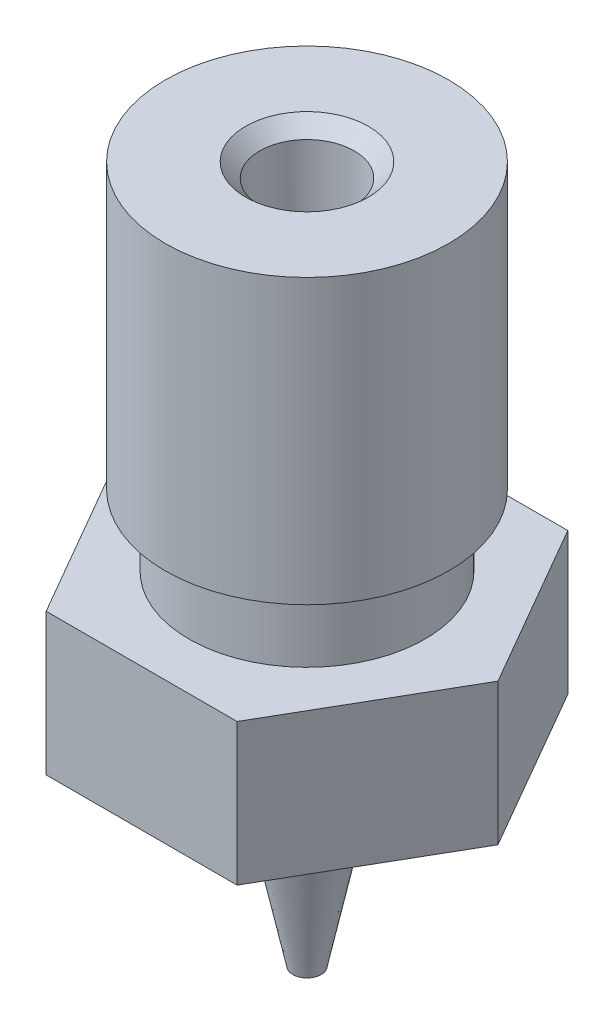
ISO-10303-21;
HEADER;
FILE_DESCRIPTION(('STEP AP214'),'2;1');
FILE_NAME('part.step','',(''),(''),'','','');
FILE_SCHEMA(('AUTOMOTIVE_DESIGN { 1 0 10303 214 1 1 1 1 }'));
ENDSEC;
DATA;
#1=APPLICATION_CONTEXT('core data for automotive mechanical design processes');
#2=APPLICATION_PROTOCOL_DEFINITION('international standard','automotive_design',2000,#1);
#3=PRODUCT_CONTEXT('',#1,'mechanical');
#4=PRODUCT('Part','Part','',(#3));
#5=PRODUCT_RELATED_PRODUCT_CATEGORY('part','',(#4));
#6=PRODUCT_DEFINITION_FORMATION('','',#4);
#7=PRODUCT_DEFINITION_CONTEXT('part definition',#1,'design');
#8=PRODUCT_DEFINITION('design','',#6,#7);
#9=PRODUCT_DEFINITION_SHAPE('','',#8);
#10=(LENGTH_UNIT() NAMED_UNIT(*) SI_UNIT(.MILLI.,.METRE.));
#11=(NAMED_UNIT(*) PLANE_ANGLE_UNIT() SI_UNIT($,.RADIAN.));
#12=(NAMED_UNIT(*) SI_UNIT($,.STERADIAN.) SOLID_ANGLE_UNIT());
#13=UNCERTAINTY_MEASURE_WITH_UNIT(LENGTH_MEASURE(1.E-05),#10,'distance_accuracy_value','');
#14=(GEOMETRIC_REPRESENTATION_CONTEXT(3) GLOBAL_UNCERTAINTY_ASSIGNED_CONTEXT((#13)) GLOBAL_UNIT_ASSIGNED_CONTEXT((#10,
#11,#12)) REPRESENTATION_CONTEXT('',''));
#15=CARTESIAN_POINT('',(0.,0.,0.));
#16=DIRECTION('',(0.,0.,1.));
#17=DIRECTION('',(1.,0.,0.));
#18=AXIS2_PLACEMENT_3D('',#15,#16,#17);
#19=CARTESIAN_POINT('',(0.,0.,0.));
#20=DIRECTION('',(0.,1.,0.));
#21=DIRECTION('',(-1.,0.,0.));
#22=AXIS2_PLACEMENT_3D('',#19,#20,#21);
#23=CONICAL_SURFACE('',#22,0.500000000000001,0.610865238198013);
#24=CARTESIAN_POINT('',(0.,2.,0.));
#25=DIRECTION('',(0.,1.,0.));
#26=DIRECTION('',(-1.,0.,0.));
#27=AXIS2_PLACEMENT_3D('',#24,#25,#26);
#28=CIRCLE('',#27,1.90041507641941);
#29=CARTESIAN_POINT('',(-1.90041507641941,2.,0.));
#30=VERTEX_POINT('',#29);
#31=EDGE_CURVE('E86',#30,#30,#28,.T.);
#32=ORIENTED_EDGE('',*,*,#31,.F.);
#33=EDGE_LOOP('',(#32));
#34=FACE_BOUND('',#33,.T.);
#35=CARTESIAN_POINT('',(0.,1.1425184053937,0.));
#36=DIRECTION('',(0.,1.,0.));
#37=DIRECTION('',(-1.,0.,0.));
#38=AXIS2_PLACEMENT_3D('',#35,#36,#37);
#39=CIRCLE('',#38,1.3);
#40=CARTESIAN_POINT('',(-1.3,1.1425184053937,0.));
#41=VERTEX_POINT('',#40);
#42=EDGE_CURVE('E12',#41,#41,#39,.F.);
#43=ORIENTED_EDGE('',*,*,#42,.F.);
#44=EDGE_LOOP('',(#43));
#45=FACE_BOUND('',#44,.T.);
#46=ADVANCED_FACE('F77',(#34,#45),#23,.T.);
#47=CARTESIAN_POINT('',(1.90041507641941,2.,0.));
#48=DIRECTION('',(0.,1.,0.));
#49=DIRECTION('',(-1.,0.,0.));
#50=AXIS2_PLACEMENT_3D('',#47,#48,#49);
#51=PLANE('',#50);
#52=DIRECTION('',(0.499999999999999,0.,0.866025403784439));
#53=VECTOR('',#52,1.);
#54=CARTESIAN_POINT('',(3.03108891324554,2.,-1.75));
#55=LINE('',#54,#53);
#56=CARTESIAN_POINT('',(2.02072594216369,2.,-3.5));
#57=VERTEX_POINT('',#56);
#58=CARTESIAN_POINT('',(4.04145188432738,2.,0.));
#59=VERTEX_POINT('',#58);
#60=EDGE_CURVE('E165',#57,#59,#55,.T.);
#61=ORIENTED_EDGE('',*,*,#60,.T.);
#62=DIRECTION('',(-0.5,0.,0.866025403784439));
#63=VECTOR('',#62,1.);
#64=CARTESIAN_POINT('',(3.03108891324553,2.,1.75));
#65=LINE('',#64,#63);
#66=CARTESIAN_POINT('',(2.02072594216369,2.,3.5));
#67=VERTEX_POINT('',#66);
#68=EDGE_CURVE('E151',#59,#67,#65,.T.);
#69=ORIENTED_EDGE('',*,*,#68,.T.);
#70=DIRECTION('',(-1.,0.,0.));
#71=VECTOR('',#70,1.);
#72=CARTESIAN_POINT('',(0.,2.,3.5));
#73=LINE('',#72,#71);
#74=CARTESIAN_POINT('',(-2.02072594216369,2.,3.5));
#75=VERTEX_POINT('',#74);
#76=EDGE_CURVE('E177',#67,#75,#73,.T.);
#77=ORIENTED_EDGE('',*,*,#76,.T.);
#78=DIRECTION('',(-0.5,0.,-0.866025403784439));
#79=VECTOR('',#78,1.);
#80=CARTESIAN_POINT('',(-3.03108891324554,2.,1.75));
#81=LINE('',#80,#79);
#82=CARTESIAN_POINT('',(-4.04145188432738,2.,0.));
#83=VERTEX_POINT('',#82);
#84=EDGE_CURVE('E181',#75,#83,#81,.T.);
#85=ORIENTED_EDGE('',*,*,#84,.T.);
#86=DIRECTION('',(0.5,0.,-0.866025403784438));
#87=VECTOR('',#86,1.);
#88=CARTESIAN_POINT('',(-3.03108891324553,2.,-1.75));
#89=LINE('',#88,#87);
#90=CARTESIAN_POINT('',(-2.02072594216369,2.,-3.5));
#91=VERTEX_POINT('',#90);
#92=EDGE_CURVE('E187',#83,#91,#89,.T.);
#93=ORIENTED_EDGE('',*,*,#92,.T.);
#94=DIRECTION('',(1.,0.,0.));
#95=VECTOR('',#94,1.);
#96=CARTESIAN_POINT('',(0.,2.,-3.5));
#97=LINE('',#96,#95);
#98=EDGE_CURVE('E158',#91,#57,#97,.T.);
#99=ORIENTED_EDGE('',*,*,#98,.T.);
#100=EDGE_LOOP('',(#61,#69,#77,#85,#93,#99));
#101=FACE_BOUND('',#100,.T.);
#102=ORIENTED_EDGE('',*,*,#31,.T.);
#103=EDGE_LOOP('',(#102));
#104=FACE_BOUND('',#103,.T.);
#105=ADVANCED_FACE('F222',(#101,#104),#51,.F.);
#106=CARTESIAN_POINT('',(3.5,5.,0.));
#107=DIRECTION('',(0.,-1.,0.));
#108=DIRECTION('',(1.,0.,0.));
#109=AXIS2_PLACEMENT_3D('',#106,#107,#108);
#110=PLANE('',#109);
#111=CARTESIAN_POINT('',(0.,5.,0.));
#112=DIRECTION('',(0.,1.,0.));
#113=DIRECTION('',(-1.,0.,0.));
#114=AXIS2_PLACEMENT_3D('',#111,#112,#113);
#115=CIRCLE('',#114,2.5);
#116=CARTESIAN_POINT('',(-2.5,5.,0.));
#117=VERTEX_POINT('',#116);
#118=EDGE_CURVE('E216',#117,#117,#115,.T.);
#119=ORIENTED_EDGE('',*,*,#118,.F.);
#120=EDGE_LOOP('',(#119));
#121=FACE_BOUND('',#120,.T.);
#122=DIRECTION('',(-0.5,0.,-0.866025403784439));
#123=VECTOR('',#122,1.);
#124=CARTESIAN_POINT('',(-3.03108891324554,5.,1.75));
#125=LINE('',#124,#123);
#126=CARTESIAN_POINT('',(-2.02072594216369,5.,3.5));
#127=VERTEX_POINT('',#126);
#128=CARTESIAN_POINT('',(-4.04145188432738,5.,0.));
#129=VERTEX_POINT('',#128);
#130=EDGE_CURVE('E183',#127,#129,#125,.T.);
#131=ORIENTED_EDGE('',*,*,#130,.F.);
#132=DIRECTION('',(-1.,0.,0.));
#133=VECTOR('',#132,1.);
#134=CARTESIAN_POINT('',(0.,5.,3.5));
#135=LINE('',#134,#133);
#136=CARTESIAN_POINT('',(2.02072594216369,5.,3.5));
#137=VERTEX_POINT('',#136);
#138=EDGE_CURVE('E134',#137,#127,#135,.T.);
#139=ORIENTED_EDGE('',*,*,#138,.F.);
#140=DIRECTION('',(-0.5,0.,0.866025403784439));
#141=VECTOR('',#140,1.);
#142=CARTESIAN_POINT('',(3.03108891324553,5.,1.75));
#143=LINE('',#142,#141);
#144=CARTESIAN_POINT('',(4.04145188432738,5.,0.));
#145=VERTEX_POINT('',#144);
#146=EDGE_CURVE('E127',#145,#137,#143,.T.);
#147=ORIENTED_EDGE('',*,*,#146,.F.);
#148=DIRECTION('',(0.499999999999999,0.,0.866025403784439));
#149=VECTOR('',#148,1.);
#150=CARTESIAN_POINT('',(3.03108891324554,5.,-1.75));
#151=LINE('',#150,#149);
#152=CARTESIAN_POINT('',(2.02072594216369,5.,-3.5));
#153=VERTEX_POINT('',#152);
#154=EDGE_CURVE('E131',#153,#145,#151,.T.);
#155=ORIENTED_EDGE('',*,*,#154,.F.);
#156=DIRECTION('',(1.,0.,0.));
#157=VECTOR('',#156,1.);
#158=CARTESIAN_POINT('',(0.,5.,-3.5));
#159=LINE('',#158,#157);
#160=CARTESIAN_POINT('',(-2.02072594216369,5.,-3.5));
#161=VERTEX_POINT('',#160);
#162=EDGE_CURVE('E147',#161,#153,#159,.T.);
#163=ORIENTED_EDGE('',*,*,#162,.F.);
#164=DIRECTION('',(0.5,0.,-0.866025403784438));
#165=VECTOR('',#164,1.);
#166=CARTESIAN_POINT('',(-3.03108891324553,5.,-1.75));
#167=LINE('',#166,#165);
#168=EDGE_CURVE('E186',#129,#161,#167,.T.);
#169=ORIENTED_EDGE('',*,*,#168,.F.);
#170=EDGE_LOOP('',(#131,#139,#147,#155,#163,#169));
#171=FACE_BOUND('',#170,.T.);
#172=ADVANCED_FACE('F129',(#121,#171),#110,.F.);
#173=CARTESIAN_POINT('',(0.,-1.12913310004202,0.));
#174=DIRECTION('',(0.,1.,0.));
#175=DIRECTION('',(-1.,0.,0.));
#176=AXIS2_PLACEMENT_3D('',#173,#174,#175);
#177=CYLINDRICAL_SURFACE('',#176,2.5);
#178=CARTESIAN_POINT('',(0.,6.5,0.));
#179=DIRECTION('',(0.,1.,0.));
#180=DIRECTION('',(-1.,0.,0.));
#181=AXIS2_PLACEMENT_3D('',#178,#179,#180);
#182=CIRCLE('',#181,2.5);
#183=CARTESIAN_POINT('',(-2.5,6.5,0.));
#184=VERTEX_POINT('',#183);
#185=EDGE_CURVE('E213',#184,#184,#182,.T.);
#186=ORIENTED_EDGE('',*,*,#185,.F.);
#187=EDGE_LOOP('',(#186));
#188=FACE_BOUND('',#187,.T.);
#189=ORIENTED_EDGE('',*,*,#118,.T.);
#190=EDGE_LOOP('',(#189));
#191=FACE_BOUND('',#190,.T.);
#192=ADVANCED_FACE('F298',(#188,#191),#177,.T.);
#193=CARTESIAN_POINT('',(2.5,6.5,0.));
#194=DIRECTION('',(0.,1.,0.));
#195=DIRECTION('',(-1.,0.,0.));
#196=AXIS2_PLACEMENT_3D('',#193,#194,#195);
#197=PLANE('',#196);
#198=CARTESIAN_POINT('',(0.,6.5,0.));
#199=DIRECTION('',(0.,1.,0.));
#200=DIRECTION('',(-1.,0.,0.));
#201=AXIS2_PLACEMENT_3D('',#198,#199,#200);
#202=CIRCLE('',#201,3.);
#203=CARTESIAN_POINT('',(-3.,6.5,0.));
#204=VERTEX_POINT('',#203);
#205=EDGE_CURVE('E210',#204,#204,#202,.T.);
#206=ORIENTED_EDGE('',*,*,#205,.F.);
#207=EDGE_LOOP('',(#206));
#208=FACE_BOUND('',#207,.T.);
#209=ORIENTED_EDGE('',*,*,#185,.T.);
#210=EDGE_LOOP('',(#209));
#211=FACE_BOUND('',#210,.T.);
#212=ADVANCED_FACE('F294',(#208,#211),#197,.F.);
#213=CARTESIAN_POINT('',(0.,-1.12913310004202,0.));
#214=DIRECTION('',(0.,1.,0.));
#215=DIRECTION('',(-1.,0.,0.));
#216=AXIS2_PLACEMENT_3D('',#213,#214,#215);
#217=CYLINDRICAL_SURFACE('',#216,3.);
#218=CARTESIAN_POINT('',(0.,12.5,0.));
#219=DIRECTION('',(0.,1.,0.));
#220=DIRECTION('',(-1.,0.,0.));
#221=AXIS2_PLACEMENT_3D('',#218,#219,#220);
#222=CIRCLE('',#221,3.);
#223=CARTESIAN_POINT('',(-3.,12.5,0.));
#224=VERTEX_POINT('',#223);
#225=EDGE_CURVE('E207',#224,#224,#222,.T.);
#226=ORIENTED_EDGE('',*,*,#225,.F.);
#227=EDGE_LOOP('',(#226));
#228=FACE_BOUND('',#227,.T.);
#229=ORIENTED_EDGE('',*,*,#205,.T.);
#230=EDGE_LOOP('',(#229));
#231=FACE_BOUND('',#230,.T.);
#232=ADVANCED_FACE('F290',(#228,#231),#217,.T.);
#233=CARTESIAN_POINT('',(3.,12.5,0.));
#234=DIRECTION('',(0.,-1.,0.));
#235=DIRECTION('',(1.,0.,0.));
#236=AXIS2_PLACEMENT_3D('',#233,#234,#235);
#237=PLANE('',#236);
#238=CARTESIAN_POINT('',(0.,12.5,0.));
#239=DIRECTION('',(0.,-1.,0.));
#240=DIRECTION('',(0.,0.,-1.));
#241=AXIS2_PLACEMENT_3D('',#238,#239,#240);
#242=CIRCLE('',#241,1.3);
#243=CARTESIAN_POINT('',(0.,12.5,-1.3));
#244=VERTEX_POINT('',#243);
#245=EDGE_CURVE('E204',#244,#244,#242,.T.);
#246=ORIENTED_EDGE('',*,*,#245,.T.);
#247=EDGE_LOOP('',(#246));
#248=FACE_BOUND('',#247,.T.);
#249=ORIENTED_EDGE('',*,*,#225,.T.);
#250=EDGE_LOOP('',(#249));
#251=FACE_BOUND('',#250,.T.);
#252=ADVANCED_FACE('F286',(#248,#251),#237,.F.);
#253=CARTESIAN_POINT('',(0.,12.2,0.));
#254=DIRECTION('',(0.,1.,0.));
#255=DIRECTION('',(0.,0.,1.));
#256=AXIS2_PLACEMENT_3D('',#253,#254,#255);
#257=CONICAL_SURFACE('',#256,1.,0.785398163397445);
#258=ORIENTED_EDGE('',*,*,#245,.F.);
#259=EDGE_LOOP('',(#258));
#260=FACE_BOUND('',#259,.T.);
#261=CARTESIAN_POINT('',(0.,12.2,0.));
#262=DIRECTION('',(0.,-1.,0.));
#263=DIRECTION('',(0.,0.,-1.));
#264=AXIS2_PLACEMENT_3D('',#261,#262,#263);
#265=CIRCLE('',#264,1.);
#266=CARTESIAN_POINT('',(0.,12.2,-1.));
#267=VERTEX_POINT('',#266);
#268=EDGE_CURVE('E201',#267,#267,#265,.T.);
#269=ORIENTED_EDGE('',*,*,#268,.T.);
#270=EDGE_LOOP('',(#269));
#271=FACE_BOUND('',#270,.T.);
#272=ADVANCED_FACE('F282',(#260,#271),#257,.F.);
#273=CARTESIAN_POINT('',(0.,0.,0.));
#274=DIRECTION('',(0.,-1.,0.));
#275=DIRECTION('',(0.,0.,-1.));
#276=AXIS2_PLACEMENT_3D('',#273,#274,#275);
#277=CYLINDRICAL_SURFACE('',#276,1.);
#278=ORIENTED_EDGE('',*,*,#268,.F.);
#279=EDGE_LOOP('',(#278));
#280=FACE_BOUND('',#279,.T.);
#281=CARTESIAN_POINT('',(0.,1.9856406460551,0.));
#282=DIRECTION('',(0.,-1.,0.));
#283=DIRECTION('',(0.,0.,-1.));
#284=AXIS2_PLACEMENT_3D('',#281,#282,#283);
#285=CIRCLE('',#284,1.);
#286=CARTESIAN_POINT('',(0.,1.9856406460551,1.));
#287=VERTEX_POINT('',#286);
#288=EDGE_CURVE('E197',#287,#287,#285,.T.);
#289=ORIENTED_EDGE('',*,*,#288,.T.);
#290=EDGE_LOOP('',(#289));
#291=FACE_BOUND('',#290,.T.);
#292=ADVANCED_FACE('F278',(#280,#291),#277,.F.);
#293=CARTESIAN_POINT('',(0.,0.6,0.));
#294=DIRECTION('',(0.,1.,0.));
#295=DIRECTION('',(0.,0.,1.));
#296=AXIS2_PLACEMENT_3D('',#293,#294,#295);
#297=CONICAL_SURFACE('',#296,0.2,0.5235987755983);
#298=CARTESIAN_POINT('',(0.,0.6,0.));
#299=DIRECTION('',(0.,-1.,0.));
#300=DIRECTION('',(0.,0.,-1.));
#301=AXIS2_PLACEMENT_3D('',#298,#299,#300);
#302=CIRCLE('',#301,0.2);
#303=CARTESIAN_POINT('',(0.,0.6,0.2));
#304=VERTEX_POINT('',#303);
#305=EDGE_CURVE('E194',#304,#304,#302,.T.);
#306=CARTESIAN_POINT('',(0.,1.9856406460551,1.));
#307=CARTESIAN_POINT('',(0.,1.97120688932536,0.991666666666668));
#308=CARTESIAN_POINT('',(0.,1.95677313259562,0.983333333333335));
#309=CARTESIAN_POINT('',(0.,1.92790561913614,0.966666666666668));
#310=CARTESIAN_POINT('',(0.,1.9134718624064,0.958333333333335));
#311=CARTESIAN_POINT('',(0.,1.88460434894692,0.941666666666668));
#312=CARTESIAN_POINT('',(0.,1.87017059221718,0.933333333333335));
#313=CARTESIAN_POINT('',(0.,1.84130307875769,0.916666666666668));
#314=CARTESIAN_POINT('',(0.,1.82686932202795,0.908333333333335));
#315=CARTESIAN_POINT('',(0.,1.79800180856847,0.891666666666668));
#316=CARTESIAN_POINT('',(0.,1.78356805183873,0.883333333333335));
#317=CARTESIAN_POINT('',(0.,1.75470053837925,0.866666666666668));
#318=CARTESIAN_POINT('',(0.,1.74026678164951,0.858333333333335));
#319=CARTESIAN_POINT('',(0.,1.71139926819003,0.841666666666668));
#320=CARTESIAN_POINT('',(0.,1.69696551146029,0.833333333333335));
#321=CARTESIAN_POINT('',(0.,1.66809799800081,0.816666666666668));
#322=CARTESIAN_POINT('',(0.,1.65366424127107,0.808333333333335));
#323=CARTESIAN_POINT('',(0.,1.62479672781159,0.791666666666668));
#324=CARTESIAN_POINT('',(0.,1.61036297108184,0.783333333333335));
#325=CARTESIAN_POINT('',(0.,1.58149545762236,0.766666666666668));
#326=CARTESIAN_POINT('',(0.,1.56706170089262,0.758333333333335));
#327=CARTESIAN_POINT('',(0.,1.53819418743314,0.741666666666668));
#328=CARTESIAN_POINT('',(0.,1.5237604307034,0.733333333333335));
#329=CARTESIAN_POINT('',(0.,1.49489291724392,0.716666666666668));
#330=CARTESIAN_POINT('',(0.,1.48045916051418,0.708333333333334));
#331=CARTESIAN_POINT('',(0.,1.4515916470547,0.691666666666668));
#332=CARTESIAN_POINT('',(0.,1.43715789032496,0.683333333333334));
#333=CARTESIAN_POINT('',(0.,1.40829037686548,0.666666666666668));
#334=CARTESIAN_POINT('',(0.,1.39385662013573,0.658333333333334));
#335=CARTESIAN_POINT('',(0.,1.36498910667625,0.641666666666668));
#336=CARTESIAN_POINT('',(0.,1.35055534994651,0.633333333333334));
#337=CARTESIAN_POINT('',(0.,1.32168783648703,0.616666666666668));
#338=CARTESIAN_POINT('',(0.,1.30725407975729,0.608333333333334));
#339=CARTESIAN_POINT('',(0.,1.27838656629781,0.591666666666668));
#340=CARTESIAN_POINT('',(0.,1.26395280956807,0.583333333333334));
#341=CARTESIAN_POINT('',(0.,1.23508529610859,0.566666666666667));
#342=CARTESIAN_POINT('',(0.,1.22065153937885,0.558333333333334));
#343=CARTESIAN_POINT('',(0.,1.19178402591937,0.541666666666667));
#344=CARTESIAN_POINT('',(0.,1.17735026918963,0.533333333333334));
#345=CARTESIAN_POINT('',(0.,1.14848275573014,0.516666666666667));
#346=CARTESIAN_POINT('',(0.,1.1340489990004,0.508333333333334));
#347=CARTESIAN_POINT('',(0.,1.10518148554092,0.491666666666667));
#348=CARTESIAN_POINT('',(0.,1.09074772881118,0.483333333333334));
#349=CARTESIAN_POINT('',(0.,1.0618802153517,0.466666666666667));
#350=CARTESIAN_POINT('',(0.,1.04744645862196,0.458333333333334));
#351=CARTESIAN_POINT('',(0.,1.01857894516248,0.441666666666667));
#352=CARTESIAN_POINT('',(0.,1.00414518843274,0.433333333333334));
#353=CARTESIAN_POINT('',(0.,0.975277674973256,0.416666666666667));
#354=CARTESIAN_POINT('',(0.,0.960843918243516,0.408333333333334));
#355=CARTESIAN_POINT('',(0.,0.931976404784034,0.391666666666667));
#356=CARTESIAN_POINT('',(0.,0.917542648054294,0.383333333333334));
#357=CARTESIAN_POINT('',(0.,0.888675134594813,0.366666666666667));
#358=CARTESIAN_POINT('',(0.,0.874241377865072,0.358333333333334));
#359=CARTESIAN_POINT('',(0.,0.845373864405591,0.341666666666667));
#360=CARTESIAN_POINT('',(0.,0.83094010767585,0.333333333333334));
#361=CARTESIAN_POINT('',(0.,0.802072594216369,0.316666666666667));
#362=CARTESIAN_POINT('',(0.,0.787638837486628,0.308333333333334));
#363=CARTESIAN_POINT('',(0.,0.758771324027147,0.291666666666667));
#364=CARTESIAN_POINT('',(0.,0.744337567297406,0.283333333333334));
#365=CARTESIAN_POINT('',(0.,0.715470053837925,0.266666666666667));
#366=CARTESIAN_POINT('',(0.,0.701036297108184,0.258333333333334));
#367=CARTESIAN_POINT('',(0.,0.672168783648703,0.241666666666667));
#368=CARTESIAN_POINT('',(0.,0.657735026918962,0.233333333333334));
#369=CARTESIAN_POINT('',(0.,0.628867513459481,0.216666666666667));
#370=CARTESIAN_POINT('',(0.,0.61443375672974,0.208333333333334));
#371=CARTESIAN_POINT('',(0.,0.6,0.2));
#372=B_SPLINE_CURVE_WITH_KNOTS('',3,(#306,#307,#308,#309,#310,#311,#312,#313,#314,#315,#316,
#317,#318,#319,#320,#321,#322,#323,#324,#325,#326,#327,#328,#329,#330,#331,#332,#333,#334,#335,
#336,#337,#338,#339,#340,#341,#342,#343,#344,#345,#346,#347,#348,#349,#350,#351,#352,#353,#354,
#355,#356,#357,#358,#359,#360,#361,#362,#363,#364,#365,#366,#367,#368,#369,#370,#371),
.UNSPECIFIED.,.F.,.F.,(4,2,2,2,2,2,2,2,2,2,2,2,2,2,2,2,2,2,2,2,2,2,2,2,2,2,2,2,2,2,2,2,4),(0.,
0.0499999999999999,0.1,0.15,0.2,0.25,0.3,0.35,0.4,0.45,0.5,0.55,0.6,0.65,0.7,0.75,0.8,0.85,0.9,
0.95,1.,1.05,1.1,1.15,1.2,1.25,1.3,1.35,1.4,1.45,1.5,1.55,1.6),.UNSPECIFIED.);
#373=EDGE_CURVE('BSEAM274',#287,#304,#372,.T.);
#374=ORIENTED_EDGE('',*,*,#288,.F.);
#375=ORIENTED_EDGE('',*,*,#305,.T.);
#376=ORIENTED_EDGE('',*,*,#373,.T.);
#377=ORIENTED_EDGE('',*,*,#373,.F.);
#378=EDGE_LOOP('',(#374,#376,#375,#377));
#379=FACE_BOUND('',#378,.T.);
#380=ADVANCED_FACE('F274',(#379),#297,.F.);
#381=CARTESIAN_POINT('',(0.,0.,0.));
#382=DIRECTION('',(0.,-1.,0.));
#383=DIRECTION('',(0.,0.,-1.));
#384=AXIS2_PLACEMENT_3D('',#381,#382,#383);
#385=CYLINDRICAL_SURFACE('',#384,0.2);
#386=ORIENTED_EDGE('',*,*,#305,.F.);
#387=EDGE_LOOP('',(#386));
#388=FACE_BOUND('',#387,.T.);
#389=CARTESIAN_POINT('',(0.,0.,0.));
#390=DIRECTION('',(0.,1.,0.));
#391=DIRECTION('',(-1.,0.,0.));
#392=AXIS2_PLACEMENT_3D('',#389,#390,#391);
#393=CIRCLE('',#392,0.200000000000001);
#394=CARTESIAN_POINT('',(-0.200000000000001,0.,0.));
#395=VERTEX_POINT('',#394);
#396=EDGE_CURVE('E154',#395,#395,#393,.T.);
#397=ORIENTED_EDGE('',*,*,#396,.F.);
#398=EDGE_LOOP('',(#397));
#399=FACE_BOUND('',#398,.T.);
#400=ADVANCED_FACE('F270',(#388,#399),#385,.F.);
#401=CARTESIAN_POINT('',(-3.03108891324554,5.,1.75));
#402=DIRECTION('',(-0.866025403784439,0.,0.5));
#403=DIRECTION('',(0.5,0.,0.866025403784439));
#404=AXIS2_PLACEMENT_3D('',#401,#402,#403);
#405=PLANE('',#404);
#406=ORIENTED_EDGE('',*,*,#84,.F.);
#407=DIRECTION('',(0.,-1.,0.));
#408=VECTOR('',#407,1.);
#409=CARTESIAN_POINT('',(-2.02072594216369,5.,3.5));
#410=LINE('',#409,#408);
#411=EDGE_CURVE('E174',#127,#75,#410,.T.);
#412=ORIENTED_EDGE('',*,*,#411,.F.);
#413=ORIENTED_EDGE('',*,*,#130,.T.);
#414=DIRECTION('',(0.,-1.,0.));
#415=VECTOR('',#414,1.);
#416=CARTESIAN_POINT('',(-4.04145188432738,5.,0.));
#417=LINE('',#416,#415);
#418=EDGE_CURVE('E92',#129,#83,#417,.T.);
#419=ORIENTED_EDGE('',*,*,#418,.T.);
#420=EDGE_LOOP('',(#406,#412,#413,#419));
#421=FACE_BOUND('',#420,.T.);
#422=ADVANCED_FACE('F267',(#421),#405,.T.);
#423=CARTESIAN_POINT('',(-3.03108891324553,5.,-1.75));
#424=DIRECTION('',(-0.866025403784438,0.,-0.5));
#425=DIRECTION('',(-0.5,0.,0.866025403784439));
#426=AXIS2_PLACEMENT_3D('',#423,#424,#425);
#427=PLANE('',#426);
#428=ORIENTED_EDGE('',*,*,#92,.F.);
#429=ORIENTED_EDGE('',*,*,#418,.F.);
#430=ORIENTED_EDGE('',*,*,#168,.T.);
#431=DIRECTION('',(0.,-1.,0.));
#432=VECTOR('',#431,1.);
#433=CARTESIAN_POINT('',(-2.02072594216369,5.,-3.5));
#434=LINE('',#433,#432);
#435=EDGE_CURVE('E153',#161,#91,#434,.T.);
#436=ORIENTED_EDGE('',*,*,#435,.T.);
#437=EDGE_LOOP('',(#428,#429,#430,#436));
#438=FACE_BOUND('',#437,.T.);
#439=ADVANCED_FACE('F263',(#438),#427,.T.);
#440=CARTESIAN_POINT('',(0.,5.,3.5));
#441=DIRECTION('',(0.,0.,1.));
#442=DIRECTION('',(1.,0.,0.));
#443=AXIS2_PLACEMENT_3D('',#440,#441,#442);
#444=PLANE('',#443);
#445=ORIENTED_EDGE('',*,*,#76,.F.);
#446=DIRECTION('',(0.,-1.,0.));
#447=VECTOR('',#446,1.);
#448=CARTESIAN_POINT('',(2.02072594216369,5.,3.5));
#449=LINE('',#448,#447);
#450=EDGE_CURVE('E139',#137,#67,#449,.T.);
#451=ORIENTED_EDGE('',*,*,#450,.F.);
#452=ORIENTED_EDGE('',*,*,#138,.T.);
#453=ORIENTED_EDGE('',*,*,#411,.T.);
#454=EDGE_LOOP('',(#445,#451,#452,#453));
#455=FACE_BOUND('',#454,.T.);
#456=ADVANCED_FACE('F260',(#455),#444,.T.);
#457=CARTESIAN_POINT('',(3.03108891324553,5.,1.75));
#458=DIRECTION('',(0.866025403784439,0.,0.5));
#459=DIRECTION('',(0.5,0.,-0.866025403784439));
#460=AXIS2_PLACEMENT_3D('',#457,#458,#459);
#461=PLANE('',#460);
#462=ORIENTED_EDGE('',*,*,#68,.F.);
#463=DIRECTION('',(0.,-1.,0.));
#464=VECTOR('',#463,1.);
#465=CARTESIAN_POINT('',(4.04145188432738,5.,0.));
#466=LINE('',#465,#464);
#467=EDGE_CURVE('E146',#145,#59,#466,.T.);
#468=ORIENTED_EDGE('',*,*,#467,.F.);
#469=ORIENTED_EDGE('',*,*,#146,.T.);
#470=ORIENTED_EDGE('',*,*,#450,.T.);
#471=EDGE_LOOP('',(#462,#468,#469,#470));
#472=FACE_BOUND('',#471,.T.);
#473=ADVANCED_FACE('F149',(#472),#461,.T.);
#474=CARTESIAN_POINT('',(0.,5.,-3.5));
#475=DIRECTION('',(0.,0.,-1.));
#476=DIRECTION('',(-1.,0.,0.));
#477=AXIS2_PLACEMENT_3D('',#474,#475,#476);
#478=PLANE('',#477);
#479=ORIENTED_EDGE('',*,*,#98,.F.);
#480=ORIENTED_EDGE('',*,*,#435,.F.);
#481=ORIENTED_EDGE('',*,*,#162,.T.);
#482=DIRECTION('',(0.,-1.,0.));
#483=VECTOR('',#482,1.);
#484=CARTESIAN_POINT('',(2.02072594216369,5.,-3.5));
#485=LINE('',#484,#483);
#486=EDGE_CURVE('E140',#153,#57,#485,.T.);
#487=ORIENTED_EDGE('',*,*,#486,.T.);
#488=EDGE_LOOP('',(#479,#480,#481,#487));
#489=FACE_BOUND('',#488,.T.);
#490=ADVANCED_FACE('F254',(#489),#478,.T.);
#491=CARTESIAN_POINT('',(3.03108891324554,5.,-1.75));
#492=DIRECTION('',(0.866025403784439,0.,-0.499999999999999));
#493=DIRECTION('',(-0.499999999999999,0.,-0.866025403784439));
#494=AXIS2_PLACEMENT_3D('',#491,#492,#493);
#495=PLANE('',#494);
#496=ORIENTED_EDGE('',*,*,#60,.F.);
#497=ORIENTED_EDGE('',*,*,#486,.F.);
#498=ORIENTED_EDGE('',*,*,#154,.T.);
#499=ORIENTED_EDGE('',*,*,#467,.T.);
#500=EDGE_LOOP('',(#496,#497,#498,#499));
#501=FACE_BOUND('',#500,.T.);
#502=ADVANCED_FACE('F145',(#501),#495,.T.);
#503=CARTESIAN_POINT('',(0.,0.,0.));
#504=DIRECTION('',(0.,-1.,0.));
#505=DIRECTION('',(1.,0.,0.));
#506=AXIS2_PLACEMENT_3D('',#503,#504,#505);
#507=PLANE('',#506);
#508=ORIENTED_EDGE('',*,*,#396,.T.);
#509=EDGE_LOOP('',(#508));
#510=FACE_BOUND('',#509,.T.);
#511=ADVANCED_FACE('F231',(#510),#507,.F.);
#512=CARTESIAN_POINT('',(0.,2.,0.));
#513=DIRECTION('',(0.,1.,0.));
#514=DIRECTION('',(-1.,0.,0.));
#515=AXIS2_PLACEMENT_3D('',#512,#513,#514);
#516=CYLINDRICAL_SURFACE('',#515,1.3);
#517=CARTESIAN_POINT('',(0.,0.550000000000002,0.));
#518=DIRECTION('',(0.,1.,0.));
#519=DIRECTION('',(-1.,0.,0.));
#520=AXIS2_PLACEMENT_3D('',#517,#518,#519);
#521=CIRCLE('',#520,1.3);
#522=CARTESIAN_POINT('',(-1.3,0.550000000000001,0.));
#523=VERTEX_POINT('',#522);
#524=EDGE_CURVE('E520',#523,#523,#521,.T.);
#525=ORIENTED_EDGE('',*,*,#524,.T.);
#526=EDGE_LOOP('',(#525));
#527=FACE_BOUND('',#526,.T.);
#528=ORIENTED_EDGE('',*,*,#42,.T.);
#529=EDGE_LOOP('',(#528));
#530=FACE_BOUND('',#529,.T.);
#531=ADVANCED_FACE('F228',(#527,#530),#516,.T.);
#532=CARTESIAN_POINT('',(0.,-2.25,0.));
#533=DIRECTION('',(0.,1.,0.));
#534=DIRECTION('',(-1.,0.,0.));
#535=AXIS2_PLACEMENT_3D('',#532,#533,#534);
#536=PLANE('',#535);
#537=CARTESIAN_POINT('',(0.,-2.25,0.));
#538=DIRECTION('',(0.,1.,0.));
#539=DIRECTION('',(-1.,0.,0.));
#540=AXIS2_PLACEMENT_3D('',#537,#538,#539);
#541=CIRCLE('',#540,0.3);
#542=CARTESIAN_POINT('',(-0.299999999999999,-2.25,0.));
#543=VERTEX_POINT('',#542);
#544=EDGE_CURVE('E161',#543,#543,#541,.T.);
#545=ORIENTED_EDGE('',*,*,#544,.F.);
#546=EDGE_LOOP('',(#545));
#547=FACE_BOUND('',#546,.T.);
#548=ADVANCED_FACE('F230',(#547),#536,.F.);
#549=CARTESIAN_POINT('',(0.,-2.25,0.));
#550=DIRECTION('',(0.,1.,0.));
#551=DIRECTION('',(-1.,0.,0.));
#552=AXIS2_PLACEMENT_3D('',#549,#550,#551);
#553=CONICAL_SURFACE('',#552,0.3,0.206004860152089);
#554=CARTESIAN_POINT('',(0.,0.550000000000002,0.));
#555=DIRECTION('',(0.,1.,0.));
#556=DIRECTION('',(-1.,0.,0.));
#557=AXIS2_PLACEMENT_3D('',#554,#555,#556);
#558=CIRCLE('',#557,0.88511414601534);
#559=CARTESIAN_POINT('',(-0.885114146015341,0.550000000000002,0.));
#560=VERTEX_POINT('',#559);
#561=EDGE_CURVE('E516',#560,#560,#558,.T.);
#562=ORIENTED_EDGE('',*,*,#561,.F.);
#563=EDGE_LOOP('',(#562));
#564=FACE_BOUND('',#563,.T.);
#565=ORIENTED_EDGE('',*,*,#544,.T.);
#566=EDGE_LOOP('',(#565));
#567=FACE_BOUND('',#566,.T.);
#568=ADVANCED_FACE('F238',(#564,#567),#553,.T.);
#569=CARTESIAN_POINT('',(0.,0.550000000000002,0.));
#570=DIRECTION('',(0.,1.,0.));
#571=DIRECTION('',(-1.,0.,0.));
#572=AXIS2_PLACEMENT_3D('',#569,#570,#571);
#573=PLANE('',#572);
#574=ORIENTED_EDGE('',*,*,#524,.F.);
#575=EDGE_LOOP('',(#574));
#576=FACE_BOUND('',#575,.T.);
#577=ORIENTED_EDGE('',*,*,#561,.T.);
#578=EDGE_LOOP('',(#577));
#579=FACE_BOUND('',#578,.T.);
#580=ADVANCED_FACE('F245',(#576,#579),#573,.F.);
#581=CLOSED_SHELL('',(#46,#105,#172,#192,#212,#232,#252,#272,#292,#380,#400,#422,#439,#456,#473,
#490,#502,#511,#531,#548,#568,#580));
#582=MANIFOLD_SOLID_BREP('B2',#581);
#583=ADVANCED_BREP_SHAPE_REPRESENTATION('',(#18,#582),#14);
#584=SHAPE_DEFINITION_REPRESENTATION(#9,#583);
ENDSEC;
END-ISO-10303-21;
